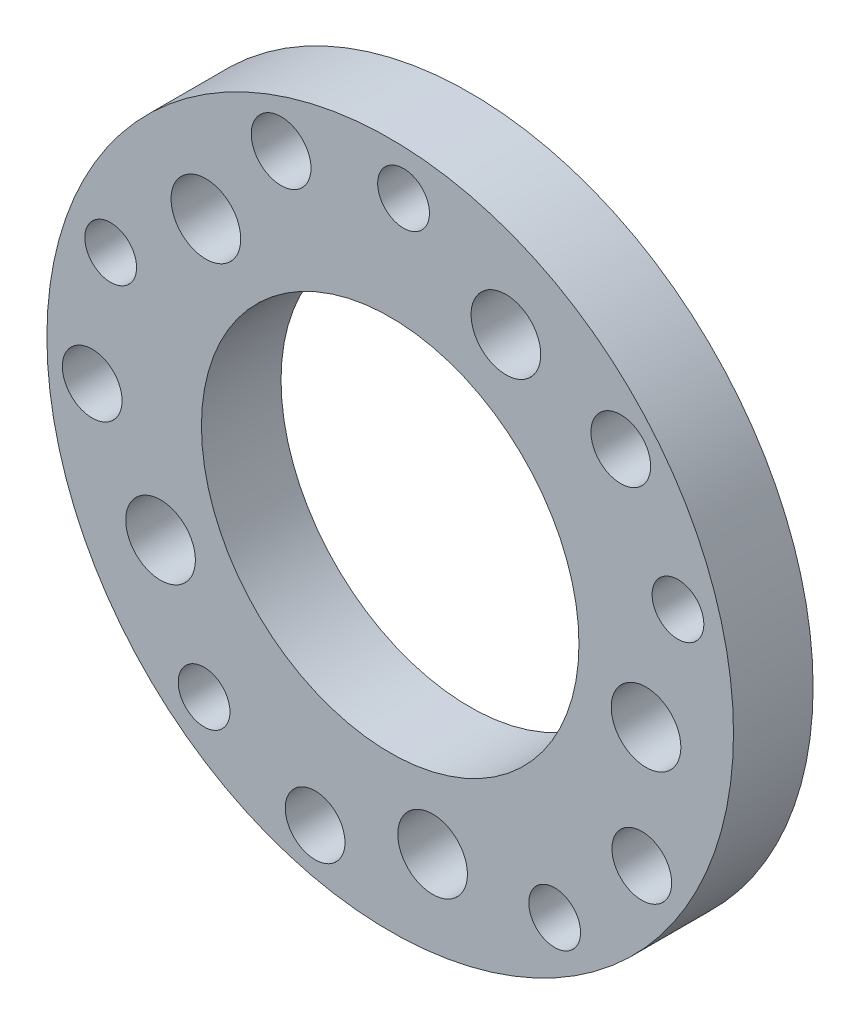
ISO-10303-21;
HEADER;
FILE_DESCRIPTION(('STEP AP214'),'2;1');
FILE_NAME('part.step','',(''),(''),'','','');
FILE_SCHEMA(('AUTOMOTIVE_DESIGN { 1 0 10303 214 1 1 1 1 }'));
ENDSEC;
DATA;
#1=APPLICATION_CONTEXT('core data for automotive mechanical design processes');
#2=APPLICATION_PROTOCOL_DEFINITION('international standard','automotive_design',2000,#1);
#3=PRODUCT_CONTEXT('',#1,'mechanical');
#4=PRODUCT('Part','Part','',(#3));
#5=PRODUCT_RELATED_PRODUCT_CATEGORY('part','',(#4));
#6=PRODUCT_DEFINITION_FORMATION('','',#4);
#7=PRODUCT_DEFINITION_CONTEXT('part definition',#1,'design');
#8=PRODUCT_DEFINITION('design','',#6,#7);
#9=PRODUCT_DEFINITION_SHAPE('','',#8);
#10=(LENGTH_UNIT() NAMED_UNIT(*) SI_UNIT(.MILLI.,.METRE.));
#11=(NAMED_UNIT(*) PLANE_ANGLE_UNIT() SI_UNIT($,.RADIAN.));
#12=(NAMED_UNIT(*) SI_UNIT($,.STERADIAN.) SOLID_ANGLE_UNIT());
#13=UNCERTAINTY_MEASURE_WITH_UNIT(LENGTH_MEASURE(1.E-05),#10,'distance_accuracy_value','');
#14=(GEOMETRIC_REPRESENTATION_CONTEXT(3) GLOBAL_UNCERTAINTY_ASSIGNED_CONTEXT((#13)) GLOBAL_UNIT_ASSIGNED_CONTEXT((#10,
#11,#12)) REPRESENTATION_CONTEXT('',''));
#15=CARTESIAN_POINT('',(0.,0.,0.));
#16=DIRECTION('',(0.,0.,1.));
#17=DIRECTION('',(1.,0.,0.));
#18=AXIS2_PLACEMENT_3D('',#15,#16,#17);
#19=CARTESIAN_POINT('',(0.,0.,4.));
#20=DIRECTION('',(0.,0.,1.));
#21=DIRECTION('',(1.,0.,0.));
#22=AXIS2_PLACEMENT_3D('',#19,#20,#21);
#23=PLANE('',#22);
#24=CARTESIAN_POINT('',(-11.5381983432804,-5.9891551149651,4.));
#25=DIRECTION('',(0.,0.,1.));
#26=DIRECTION('',(1.,0.,0.));
#27=AXIS2_PLACEMENT_3D('',#24,#25,#26);
#28=CIRCLE('',#27,1.75000000000102);
#29=CARTESIAN_POINT('',(-9.7881983432794,-5.9891551149651,4.));
#30=VERTEX_POINT('',#29);
#31=EDGE_CURVE('E160',#30,#30,#28,.T.);
#32=ORIENTED_EDGE('',*,*,#31,.F.);
#33=EDGE_LOOP('',(#32));
#34=FACE_BOUND('',#33,.T.);
#35=CARTESIAN_POINT('',(12.854935594452,-1.93665455425201,4.));
#36=DIRECTION('',(0.,0.,1.));
#37=DIRECTION('',(1.,0.,0.));
#38=AXIS2_PLACEMENT_3D('',#35,#36,#37);
#39=CIRCLE('',#38,1.74999999999994);
#40=CARTESIAN_POINT('',(14.6049355944519,-1.93665455425201,4.));
#41=VERTEX_POINT('',#40);
#42=EDGE_CURVE('E144',#41,#41,#39,.T.);
#43=ORIENTED_EDGE('',*,*,#42,.F.);
#44=EDGE_LOOP('',(#43));
#45=FACE_BOUND('',#44,.T.);
#46=CARTESIAN_POINT('',(-5.48108740948667,13.9627246914615,4.));
#47=DIRECTION('',(0.,0.,1.));
#48=DIRECTION('',(1.,0.,0.));
#49=AXIS2_PLACEMENT_3D('',#46,#47,#48);
#50=CIRCLE('',#49,1.5);
#51=CARTESIAN_POINT('',(-3.98108740948667,13.9627246914615,4.));
#52=VERTEX_POINT('',#51);
#53=EDGE_CURVE('E128',#52,#52,#50,.T.);
#54=ORIENTED_EDGE('',*,*,#53,.F.);
#55=EDGE_LOOP('',(#54));
#56=FACE_BOUND('',#55,.T.);
#57=CARTESIAN_POINT('',(14.4591650686077,3.9915592841338,4.));
#58=DIRECTION('',(0.,0.,1.));
#59=DIRECTION('',(1.,0.,0.));
#60=AXIS2_PLACEMENT_3D('',#57,#58,#59);
#61=CIRCLE('',#60,1.3);
#62=CARTESIAN_POINT('',(15.7591650686077,3.9915592841338,4.));
#63=VERTEX_POINT('',#62);
#64=EDGE_CURVE('E112',#63,#63,#61,.T.);
#65=ORIENTED_EDGE('',*,*,#64,.F.);
#66=EDGE_LOOP('',(#65));
#67=FACE_BOUND('',#66,.T.);
#68=CARTESIAN_POINT('',(0.671929263318479,14.9849428115391,4.));
#69=DIRECTION('',(0.,0.,1.));
#70=DIRECTION('',(1.,0.,0.));
#71=AXIS2_PLACEMENT_3D('',#68,#69,#70);
#72=CIRCLE('',#71,1.3);
#73=CARTESIAN_POINT('',(1.97192926331848,14.9849428115391,4.));
#74=VERTEX_POINT('',#73);
#75=EDGE_CURVE('E96',#74,#74,#72,.T.);
#76=ORIENTED_EDGE('',*,*,#75,.F.);
#77=EDGE_LOOP('',(#76));
#78=FACE_BOUND('',#77,.T.);
#79=CARTESIAN_POINT('',(-14.0438899458412,5.26964469287068,4.));
#80=DIRECTION('',(0.,0.,1.));
#81=DIRECTION('',(1.,0.,0.));
#82=AXIS2_PLACEMENT_3D('',#79,#80,#81);
#83=CIRCLE('',#82,1.3);
#84=CARTESIAN_POINT('',(-12.7438899458412,5.26964469287068,4.));
#85=VERTEX_POINT('',#84);
#86=EDGE_CURVE('E80',#85,#85,#83,.T.);
#87=ORIENTED_EDGE('',*,*,#86,.F.);
#88=EDGE_LOOP('',(#87));
#89=FACE_BOUND('',#88,.T.);
#90=CARTESIAN_POINT('',(11.5855911458645,9.52754311461596,4.));
#91=DIRECTION('',(0.,0.,1.));
#92=DIRECTION('',(1.,0.,0.));
#93=AXIS2_PLACEMENT_3D('',#90,#91,#92);
#94=CIRCLE('',#93,1.5);
#95=CARTESIAN_POINT('',(13.0855911458645,9.52754311461596,4.));
#96=VERTEX_POINT('',#95);
#97=EDGE_CURVE('E64',#96,#96,#94,.T.);
#98=ORIENTED_EDGE('',*,*,#97,.F.);
#99=EDGE_LOOP('',(#98));
#100=FACE_BOUND('',#99,.T.);
#101=CARTESIAN_POINT('',(0.,0.,4.));
#102=DIRECTION('',(0.,0.,1.));
#103=DIRECTION('',(1.,0.,0.));
#104=AXIS2_PLACEMENT_3D('',#101,#102,#103);
#105=CIRCLE('',#104,9.485);
#106=CARTESIAN_POINT('',(9.485,0.,4.));
#107=VERTEX_POINT('',#106);
#108=EDGE_CURVE('E50',#107,#107,#105,.T.);
#109=ORIENTED_EDGE('',*,*,#108,.F.);
#110=EDGE_LOOP('',(#109));
#111=FACE_BOUND('',#110,.T.);
#112=CARTESIAN_POINT('',(0.,0.,4.));
#113=DIRECTION('',(0.,0.,1.));
#114=DIRECTION('',(1.,0.,0.));
#115=AXIS2_PLACEMENT_3D('',#112,#113,#114);
#116=CIRCLE('',#115,17.25);
#117=CARTESIAN_POINT('',(17.25,0.,4.));
#118=VERTEX_POINT('',#117);
#119=EDGE_CURVE('E10',#118,#118,#116,.T.);
#120=ORIENTED_EDGE('',*,*,#119,.T.);
#121=EDGE_LOOP('',(#120));
#122=FACE_BOUND('',#121,.T.);
#123=CARTESIAN_POINT('',(8.26432619802639,-12.5180235058341,4.));
#124=DIRECTION('',(0.,0.,1.));
#125=DIRECTION('',(1.,0.,0.));
#126=AXIS2_PLACEMENT_3D('',#123,#124,#125);
#127=CIRCLE('',#126,1.3);
#128=CARTESIAN_POINT('',(9.56432619802639,-12.5180235058341,4.));
#129=VERTEX_POINT('',#128);
#130=EDGE_CURVE('E56',#129,#129,#127,.T.);
#131=ORIENTED_EDGE('',*,*,#130,.F.);
#132=EDGE_LOOP('',(#131));
#133=FACE_BOUND('',#132,.T.);
#134=CARTESIAN_POINT('',(-9.35153058411119,-11.7281232827095,4.));
#135=DIRECTION('',(0.,0.,1.));
#136=DIRECTION('',(1.,0.,0.));
#137=AXIS2_PLACEMENT_3D('',#134,#135,#136);
#138=CIRCLE('',#137,1.3);
#139=CARTESIAN_POINT('',(-8.05153058411119,-11.7281232827095,4.));
#140=VERTEX_POINT('',#139);
#141=EDGE_CURVE('E72',#140,#140,#138,.T.);
#142=ORIENTED_EDGE('',*,*,#141,.F.);
#143=EDGE_LOOP('',(#142));
#144=FACE_BOUND('',#143,.T.);
#145=CARTESIAN_POINT('',(12.6413765173913,-8.07437921734947,4.));
#146=DIRECTION('',(0.,0.,1.));
#147=DIRECTION('',(1.,0.,0.));
#148=AXIS2_PLACEMENT_3D('',#145,#146,#147);
#149=CIRCLE('',#148,1.5);
#150=CARTESIAN_POINT('',(14.1413765173913,-8.07437921734947,4.));
#151=VERTEX_POINT('',#150);
#152=EDGE_CURVE('E88',#151,#151,#149,.T.);
#153=ORIENTED_EDGE('',*,*,#152,.F.);
#154=EDGE_LOOP('',(#153));
#155=FACE_BOUND('',#154,.T.);
#156=CARTESIAN_POINT('',(-3.77279079353133,-14.5177839089944,4.));
#157=DIRECTION('',(0.,0.,1.));
#158=DIRECTION('',(1.,0.,0.));
#159=AXIS2_PLACEMENT_3D('',#156,#157,#158);
#160=CIRCLE('',#159,1.5);
#161=CARTESIAN_POINT('',(-2.27279079353133,-14.5177839089944,4.));
#162=VERTEX_POINT('',#161);
#163=EDGE_CURVE('E104',#162,#162,#160,.T.);
#164=ORIENTED_EDGE('',*,*,#163,.F.);
#165=EDGE_LOOP('',(#164));
#166=FACE_BOUND('',#165,.T.);
#167=CARTESIAN_POINT('',(-14.9730894602358,-0.898104679736045,4.));
#168=DIRECTION('',(0.,0.,1.));
#169=DIRECTION('',(1.,0.,0.));
#170=AXIS2_PLACEMENT_3D('',#167,#168,#169);
#171=CIRCLE('',#170,1.5);
#172=CARTESIAN_POINT('',(-13.4730894602358,-0.898104679736045,4.));
#173=VERTEX_POINT('',#172);
#174=EDGE_CURVE('E120',#173,#173,#171,.T.);
#175=ORIENTED_EDGE('',*,*,#174,.F.);
#176=EDGE_LOOP('',(#175));
#177=FACE_BOUND('',#176,.T.);
#178=CARTESIAN_POINT('',(5.81426149391524,11.6273110941599,4.));
#179=DIRECTION('',(0.,0.,1.));
#180=DIRECTION('',(1.,0.,0.));
#181=AXIS2_PLACEMENT_3D('',#178,#179,#180);
#182=CIRCLE('',#181,1.75);
#183=CARTESIAN_POINT('',(7.56426149391524,11.6273110941599,4.));
#184=VERTEX_POINT('',#183);
#185=EDGE_CURVE('E136',#184,#184,#182,.T.);
#186=ORIENTED_EDGE('',*,*,#185,.F.);
#187=EDGE_LOOP('',(#186));
#188=FACE_BOUND('',#187,.T.);
#189=CARTESIAN_POINT('',(2.1305256266476,-12.8242294331553,4.));
#190=DIRECTION('',(0.,0.,1.));
#191=DIRECTION('',(1.,0.,0.));
#192=AXIS2_PLACEMENT_3D('',#189,#190,#191);
#193=CIRCLE('',#192,1.75000000000055);
#194=CARTESIAN_POINT('',(3.88052562664815,-12.8242294331553,4.));
#195=VERTEX_POINT('',#194);
#196=EDGE_CURVE('E152',#195,#195,#193,.T.);
#197=ORIENTED_EDGE('',*,*,#196,.F.);
#198=EDGE_LOOP('',(#197));
#199=FACE_BOUND('',#198,.T.);
#200=CARTESIAN_POINT('',(-9.26152437173195,9.12272800821123,4.));
#201=DIRECTION('',(0.,0.,1.));
#202=DIRECTION('',(1.,0.,0.));
#203=AXIS2_PLACEMENT_3D('',#200,#201,#202);
#204=CIRCLE('',#203,1.75000000000074);
#205=CARTESIAN_POINT('',(-7.51152437173121,9.12272800821123,4.));
#206=VERTEX_POINT('',#205);
#207=EDGE_CURVE('E168',#206,#206,#204,.T.);
#208=ORIENTED_EDGE('',*,*,#207,.F.);
#209=EDGE_LOOP('',(#208));
#210=FACE_BOUND('',#209,.T.);
#211=ADVANCED_FACE('F37',(#34,#45,#56,#67,#78,#89,#100,#111,#122,#133,#144,#155,#166,#177,#188,
#199,#210),#23,.T.);
#212=CARTESIAN_POINT('',(0.,0.,0.));
#213=DIRECTION('',(0.,0.,1.));
#214=DIRECTION('',(1.,0.,0.));
#215=AXIS2_PLACEMENT_3D('',#212,#213,#214);
#216=PLANE('',#215);
#217=CARTESIAN_POINT('',(0.,0.,0.));
#218=DIRECTION('',(0.,0.,1.));
#219=DIRECTION('',(1.,0.,0.));
#220=AXIS2_PLACEMENT_3D('',#217,#218,#219);
#221=CIRCLE('',#220,17.25);
#222=CARTESIAN_POINT('',(17.25,0.,0.));
#223=VERTEX_POINT('',#222);
#224=EDGE_CURVE('E41',#223,#223,#221,.T.);
#225=ORIENTED_EDGE('',*,*,#224,.F.);
#226=EDGE_LOOP('',(#225));
#227=FACE_BOUND('',#226,.T.);
#228=CARTESIAN_POINT('',(0.,0.,0.));
#229=DIRECTION('',(0.,0.,1.));
#230=DIRECTION('',(1.,0.,0.));
#231=AXIS2_PLACEMENT_3D('',#228,#229,#230);
#232=CIRCLE('',#231,9.485);
#233=CARTESIAN_POINT('',(9.485,0.,0.));
#234=VERTEX_POINT('',#233);
#235=EDGE_CURVE('E52',#234,#234,#232,.T.);
#236=ORIENTED_EDGE('',*,*,#235,.T.);
#237=EDGE_LOOP('',(#236));
#238=FACE_BOUND('',#237,.T.);
#239=CARTESIAN_POINT('',(8.26432619802639,-12.5180235058341,0.));
#240=DIRECTION('',(0.,0.,1.));
#241=DIRECTION('',(1.,0.,0.));
#242=AXIS2_PLACEMENT_3D('',#239,#240,#241);
#243=CIRCLE('',#242,1.3);
#244=CARTESIAN_POINT('',(9.56432619802639,-12.5180235058341,0.));
#245=VERTEX_POINT('',#244);
#246=EDGE_CURVE('E60',#245,#245,#243,.T.);
#247=ORIENTED_EDGE('',*,*,#246,.T.);
#248=EDGE_LOOP('',(#247));
#249=FACE_BOUND('',#248,.T.);
#250=CARTESIAN_POINT('',(11.5855911458645,9.52754311461596,0.));
#251=DIRECTION('',(0.,0.,1.));
#252=DIRECTION('',(1.,0.,0.));
#253=AXIS2_PLACEMENT_3D('',#250,#251,#252);
#254=CIRCLE('',#253,1.5);
#255=CARTESIAN_POINT('',(13.0855911458645,9.52754311461596,0.));
#256=VERTEX_POINT('',#255);
#257=EDGE_CURVE('E68',#256,#256,#254,.T.);
#258=ORIENTED_EDGE('',*,*,#257,.T.);
#259=EDGE_LOOP('',(#258));
#260=FACE_BOUND('',#259,.T.);
#261=CARTESIAN_POINT('',(-9.35153058411119,-11.7281232827095,0.));
#262=DIRECTION('',(0.,0.,1.));
#263=DIRECTION('',(1.,0.,0.));
#264=AXIS2_PLACEMENT_3D('',#261,#262,#263);
#265=CIRCLE('',#264,1.3);
#266=CARTESIAN_POINT('',(-8.05153058411119,-11.7281232827095,0.));
#267=VERTEX_POINT('',#266);
#268=EDGE_CURVE('E76',#267,#267,#265,.T.);
#269=ORIENTED_EDGE('',*,*,#268,.T.);
#270=EDGE_LOOP('',(#269));
#271=FACE_BOUND('',#270,.T.);
#272=CARTESIAN_POINT('',(-14.0438899458412,5.26964469287068,0.));
#273=DIRECTION('',(0.,0.,1.));
#274=DIRECTION('',(1.,0.,0.));
#275=AXIS2_PLACEMENT_3D('',#272,#273,#274);
#276=CIRCLE('',#275,1.3);
#277=CARTESIAN_POINT('',(-12.7438899458412,5.26964469287068,0.));
#278=VERTEX_POINT('',#277);
#279=EDGE_CURVE('E84',#278,#278,#276,.T.);
#280=ORIENTED_EDGE('',*,*,#279,.T.);
#281=EDGE_LOOP('',(#280));
#282=FACE_BOUND('',#281,.T.);
#283=CARTESIAN_POINT('',(12.6413765173913,-8.07437921734947,0.));
#284=DIRECTION('',(0.,0.,1.));
#285=DIRECTION('',(1.,0.,0.));
#286=AXIS2_PLACEMENT_3D('',#283,#284,#285);
#287=CIRCLE('',#286,1.5);
#288=CARTESIAN_POINT('',(14.1413765173913,-8.07437921734947,0.));
#289=VERTEX_POINT('',#288);
#290=EDGE_CURVE('E92',#289,#289,#287,.T.);
#291=ORIENTED_EDGE('',*,*,#290,.T.);
#292=EDGE_LOOP('',(#291));
#293=FACE_BOUND('',#292,.T.);
#294=CARTESIAN_POINT('',(0.671929263318479,14.9849428115391,0.));
#295=DIRECTION('',(0.,0.,1.));
#296=DIRECTION('',(1.,0.,0.));
#297=AXIS2_PLACEMENT_3D('',#294,#295,#296);
#298=CIRCLE('',#297,1.3);
#299=CARTESIAN_POINT('',(1.97192926331848,14.9849428115391,0.));
#300=VERTEX_POINT('',#299);
#301=EDGE_CURVE('E100',#300,#300,#298,.T.);
#302=ORIENTED_EDGE('',*,*,#301,.T.);
#303=EDGE_LOOP('',(#302));
#304=FACE_BOUND('',#303,.T.);
#305=CARTESIAN_POINT('',(-3.77279079353133,-14.5177839089944,0.));
#306=DIRECTION('',(0.,0.,1.));
#307=DIRECTION('',(1.,0.,0.));
#308=AXIS2_PLACEMENT_3D('',#305,#306,#307);
#309=CIRCLE('',#308,1.5);
#310=CARTESIAN_POINT('',(-2.27279079353133,-14.5177839089944,0.));
#311=VERTEX_POINT('',#310);
#312=EDGE_CURVE('E108',#311,#311,#309,.T.);
#313=ORIENTED_EDGE('',*,*,#312,.T.);
#314=EDGE_LOOP('',(#313));
#315=FACE_BOUND('',#314,.T.);
#316=CARTESIAN_POINT('',(14.4591650686077,3.9915592841338,0.));
#317=DIRECTION('',(0.,0.,1.));
#318=DIRECTION('',(1.,0.,0.));
#319=AXIS2_PLACEMENT_3D('',#316,#317,#318);
#320=CIRCLE('',#319,1.3);
#321=CARTESIAN_POINT('',(15.7591650686077,3.9915592841338,0.));
#322=VERTEX_POINT('',#321);
#323=EDGE_CURVE('E116',#322,#322,#320,.T.);
#324=ORIENTED_EDGE('',*,*,#323,.T.);
#325=EDGE_LOOP('',(#324));
#326=FACE_BOUND('',#325,.T.);
#327=CARTESIAN_POINT('',(-14.9730894602358,-0.898104679736045,0.));
#328=DIRECTION('',(0.,0.,1.));
#329=DIRECTION('',(1.,0.,0.));
#330=AXIS2_PLACEMENT_3D('',#327,#328,#329);
#331=CIRCLE('',#330,1.5);
#332=CARTESIAN_POINT('',(-13.4730894602358,-0.898104679736045,0.));
#333=VERTEX_POINT('',#332);
#334=EDGE_CURVE('E124',#333,#333,#331,.T.);
#335=ORIENTED_EDGE('',*,*,#334,.T.);
#336=EDGE_LOOP('',(#335));
#337=FACE_BOUND('',#336,.T.);
#338=CARTESIAN_POINT('',(-5.48108740948667,13.9627246914615,0.));
#339=DIRECTION('',(0.,0.,1.));
#340=DIRECTION('',(1.,0.,0.));
#341=AXIS2_PLACEMENT_3D('',#338,#339,#340);
#342=CIRCLE('',#341,1.5);
#343=CARTESIAN_POINT('',(-3.98108740948667,13.9627246914615,0.));
#344=VERTEX_POINT('',#343);
#345=EDGE_CURVE('E132',#344,#344,#342,.T.);
#346=ORIENTED_EDGE('',*,*,#345,.T.);
#347=EDGE_LOOP('',(#346));
#348=FACE_BOUND('',#347,.T.);
#349=CARTESIAN_POINT('',(5.81426149391524,11.6273110941599,0.));
#350=DIRECTION('',(0.,0.,1.));
#351=DIRECTION('',(1.,0.,0.));
#352=AXIS2_PLACEMENT_3D('',#349,#350,#351);
#353=CIRCLE('',#352,1.75);
#354=CARTESIAN_POINT('',(7.56426149391524,11.6273110941599,0.));
#355=VERTEX_POINT('',#354);
#356=EDGE_CURVE('E140',#355,#355,#353,.T.);
#357=ORIENTED_EDGE('',*,*,#356,.T.);
#358=EDGE_LOOP('',(#357));
#359=FACE_BOUND('',#358,.T.);
#360=CARTESIAN_POINT('',(12.854935594452,-1.93665455425201,0.));
#361=DIRECTION('',(0.,0.,1.));
#362=DIRECTION('',(1.,0.,0.));
#363=AXIS2_PLACEMENT_3D('',#360,#361,#362);
#364=CIRCLE('',#363,1.74999999999994);
#365=CARTESIAN_POINT('',(14.6049355944519,-1.93665455425201,0.));
#366=VERTEX_POINT('',#365);
#367=EDGE_CURVE('E148',#366,#366,#364,.T.);
#368=ORIENTED_EDGE('',*,*,#367,.T.);
#369=EDGE_LOOP('',(#368));
#370=FACE_BOUND('',#369,.T.);
#371=CARTESIAN_POINT('',(2.1305256266476,-12.8242294331553,0.));
#372=DIRECTION('',(0.,0.,1.));
#373=DIRECTION('',(1.,0.,0.));
#374=AXIS2_PLACEMENT_3D('',#371,#372,#373);
#375=CIRCLE('',#374,1.75000000000055);
#376=CARTESIAN_POINT('',(3.88052562664815,-12.8242294331553,0.));
#377=VERTEX_POINT('',#376);
#378=EDGE_CURVE('E156',#377,#377,#375,.T.);
#379=ORIENTED_EDGE('',*,*,#378,.T.);
#380=EDGE_LOOP('',(#379));
#381=FACE_BOUND('',#380,.T.);
#382=CARTESIAN_POINT('',(-11.5381983432804,-5.9891551149651,0.));
#383=DIRECTION('',(0.,0.,1.));
#384=DIRECTION('',(1.,0.,0.));
#385=AXIS2_PLACEMENT_3D('',#382,#383,#384);
#386=CIRCLE('',#385,1.75000000000102);
#387=CARTESIAN_POINT('',(-9.7881983432794,-5.9891551149651,0.));
#388=VERTEX_POINT('',#387);
#389=EDGE_CURVE('E164',#388,#388,#386,.T.);
#390=ORIENTED_EDGE('',*,*,#389,.T.);
#391=EDGE_LOOP('',(#390));
#392=FACE_BOUND('',#391,.T.);
#393=CARTESIAN_POINT('',(-9.26152437173195,9.12272800821123,0.));
#394=DIRECTION('',(0.,0.,1.));
#395=DIRECTION('',(1.,0.,0.));
#396=AXIS2_PLACEMENT_3D('',#393,#394,#395);
#397=CIRCLE('',#396,1.75000000000074);
#398=CARTESIAN_POINT('',(-7.51152437173121,9.12272800821123,0.));
#399=VERTEX_POINT('',#398);
#400=EDGE_CURVE('E172',#399,#399,#397,.T.);
#401=ORIENTED_EDGE('',*,*,#400,.T.);
#402=EDGE_LOOP('',(#401));
#403=FACE_BOUND('',#402,.T.);
#404=ADVANCED_FACE('F184',(#227,#238,#249,#260,#271,#282,#293,#304,#315,#326,#337,#348,#359,
#370,#381,#392,#403),#216,.F.);
#405=CARTESIAN_POINT('',(0.,0.,4.));
#406=DIRECTION('',(0.,0.,-1.));
#407=DIRECTION('',(-1.,0.,0.));
#408=AXIS2_PLACEMENT_3D('',#405,#406,#407);
#409=CYLINDRICAL_SURFACE('',#408,17.25);
#410=ORIENTED_EDGE('',*,*,#119,.F.);
#411=EDGE_LOOP('',(#410));
#412=FACE_BOUND('',#411,.T.);
#413=ORIENTED_EDGE('',*,*,#224,.T.);
#414=EDGE_LOOP('',(#413));
#415=FACE_BOUND('',#414,.T.);
#416=ADVANCED_FACE('F39',(#412,#415),#409,.T.);
#417=CARTESIAN_POINT('',(0.,0.,4.));
#418=DIRECTION('',(0.,0.,-1.));
#419=DIRECTION('',(-1.,0.,0.));
#420=AXIS2_PLACEMENT_3D('',#417,#418,#419);
#421=CYLINDRICAL_SURFACE('',#420,9.485);
#422=ORIENTED_EDGE('',*,*,#108,.T.);
#423=EDGE_LOOP('',(#422));
#424=FACE_BOUND('',#423,.T.);
#425=ORIENTED_EDGE('',*,*,#235,.F.);
#426=EDGE_LOOP('',(#425));
#427=FACE_BOUND('',#426,.T.);
#428=ADVANCED_FACE('F194',(#424,#427),#421,.F.);
#429=CARTESIAN_POINT('',(8.26432619802639,-12.5180235058341,4.));
#430=DIRECTION('',(0.,0.,-1.));
#431=DIRECTION('',(-1.,0.,0.));
#432=AXIS2_PLACEMENT_3D('',#429,#430,#431);
#433=CYLINDRICAL_SURFACE('',#432,1.3);
#434=ORIENTED_EDGE('',*,*,#130,.T.);
#435=EDGE_LOOP('',(#434));
#436=FACE_BOUND('',#435,.T.);
#437=ORIENTED_EDGE('',*,*,#246,.F.);
#438=EDGE_LOOP('',(#437));
#439=FACE_BOUND('',#438,.T.);
#440=ADVANCED_FACE('F197',(#436,#439),#433,.F.);
#441=CARTESIAN_POINT('',(11.5855911458645,9.52754311461596,4.));
#442=DIRECTION('',(0.,0.,-1.));
#443=DIRECTION('',(-1.,0.,0.));
#444=AXIS2_PLACEMENT_3D('',#441,#442,#443);
#445=CYLINDRICAL_SURFACE('',#444,1.5);
#446=ORIENTED_EDGE('',*,*,#97,.T.);
#447=EDGE_LOOP('',(#446));
#448=FACE_BOUND('',#447,.T.);
#449=ORIENTED_EDGE('',*,*,#257,.F.);
#450=EDGE_LOOP('',(#449));
#451=FACE_BOUND('',#450,.T.);
#452=ADVANCED_FACE('F201',(#448,#451),#445,.F.);
#453=CARTESIAN_POINT('',(-9.35153058411119,-11.7281232827095,4.));
#454=DIRECTION('',(0.,0.,-1.));
#455=DIRECTION('',(-1.,0.,0.));
#456=AXIS2_PLACEMENT_3D('',#453,#454,#455);
#457=CYLINDRICAL_SURFACE('',#456,1.3);
#458=ORIENTED_EDGE('',*,*,#141,.T.);
#459=EDGE_LOOP('',(#458));
#460=FACE_BOUND('',#459,.T.);
#461=ORIENTED_EDGE('',*,*,#268,.F.);
#462=EDGE_LOOP('',(#461));
#463=FACE_BOUND('',#462,.T.);
#464=ADVANCED_FACE('F205',(#460,#463),#457,.F.);
#465=CARTESIAN_POINT('',(-14.0438899458412,5.26964469287068,4.));
#466=DIRECTION('',(0.,0.,-1.));
#467=DIRECTION('',(-1.,0.,0.));
#468=AXIS2_PLACEMENT_3D('',#465,#466,#467);
#469=CYLINDRICAL_SURFACE('',#468,1.3);
#470=ORIENTED_EDGE('',*,*,#86,.T.);
#471=EDGE_LOOP('',(#470));
#472=FACE_BOUND('',#471,.T.);
#473=ORIENTED_EDGE('',*,*,#279,.F.);
#474=EDGE_LOOP('',(#473));
#475=FACE_BOUND('',#474,.T.);
#476=ADVANCED_FACE('F209',(#472,#475),#469,.F.);
#477=CARTESIAN_POINT('',(12.6413765173913,-8.07437921734947,4.));
#478=DIRECTION('',(0.,0.,-1.));
#479=DIRECTION('',(-1.,0.,0.));
#480=AXIS2_PLACEMENT_3D('',#477,#478,#479);
#481=CYLINDRICAL_SURFACE('',#480,1.5);
#482=ORIENTED_EDGE('',*,*,#152,.T.);
#483=EDGE_LOOP('',(#482));
#484=FACE_BOUND('',#483,.T.);
#485=ORIENTED_EDGE('',*,*,#290,.F.);
#486=EDGE_LOOP('',(#485));
#487=FACE_BOUND('',#486,.T.);
#488=ADVANCED_FACE('F213',(#484,#487),#481,.F.);
#489=CARTESIAN_POINT('',(0.671929263318479,14.9849428115391,4.));
#490=DIRECTION('',(0.,0.,-1.));
#491=DIRECTION('',(-1.,0.,0.));
#492=AXIS2_PLACEMENT_3D('',#489,#490,#491);
#493=CYLINDRICAL_SURFACE('',#492,1.3);
#494=ORIENTED_EDGE('',*,*,#75,.T.);
#495=EDGE_LOOP('',(#494));
#496=FACE_BOUND('',#495,.T.);
#497=ORIENTED_EDGE('',*,*,#301,.F.);
#498=EDGE_LOOP('',(#497));
#499=FACE_BOUND('',#498,.T.);
#500=ADVANCED_FACE('F217',(#496,#499),#493,.F.);
#501=CARTESIAN_POINT('',(-3.77279079353133,-14.5177839089944,4.));
#502=DIRECTION('',(0.,0.,-1.));
#503=DIRECTION('',(-1.,0.,0.));
#504=AXIS2_PLACEMENT_3D('',#501,#502,#503);
#505=CYLINDRICAL_SURFACE('',#504,1.5);
#506=ORIENTED_EDGE('',*,*,#163,.T.);
#507=EDGE_LOOP('',(#506));
#508=FACE_BOUND('',#507,.T.);
#509=ORIENTED_EDGE('',*,*,#312,.F.);
#510=EDGE_LOOP('',(#509));
#511=FACE_BOUND('',#510,.T.);
#512=ADVANCED_FACE('F221',(#508,#511),#505,.F.);
#513=CARTESIAN_POINT('',(14.4591650686077,3.9915592841338,4.));
#514=DIRECTION('',(0.,0.,-1.));
#515=DIRECTION('',(-1.,0.,0.));
#516=AXIS2_PLACEMENT_3D('',#513,#514,#515);
#517=CYLINDRICAL_SURFACE('',#516,1.3);
#518=ORIENTED_EDGE('',*,*,#64,.T.);
#519=EDGE_LOOP('',(#518));
#520=FACE_BOUND('',#519,.T.);
#521=ORIENTED_EDGE('',*,*,#323,.F.);
#522=EDGE_LOOP('',(#521));
#523=FACE_BOUND('',#522,.T.);
#524=ADVANCED_FACE('F225',(#520,#523),#517,.F.);
#525=CARTESIAN_POINT('',(-14.9730894602358,-0.898104679736045,4.));
#526=DIRECTION('',(0.,0.,-1.));
#527=DIRECTION('',(-1.,0.,0.));
#528=AXIS2_PLACEMENT_3D('',#525,#526,#527);
#529=CYLINDRICAL_SURFACE('',#528,1.5);
#530=ORIENTED_EDGE('',*,*,#174,.T.);
#531=EDGE_LOOP('',(#530));
#532=FACE_BOUND('',#531,.T.);
#533=ORIENTED_EDGE('',*,*,#334,.F.);
#534=EDGE_LOOP('',(#533));
#535=FACE_BOUND('',#534,.T.);
#536=ADVANCED_FACE('F229',(#532,#535),#529,.F.);
#537=CARTESIAN_POINT('',(-5.48108740948667,13.9627246914615,4.));
#538=DIRECTION('',(0.,0.,-1.));
#539=DIRECTION('',(-1.,0.,0.));
#540=AXIS2_PLACEMENT_3D('',#537,#538,#539);
#541=CYLINDRICAL_SURFACE('',#540,1.5);
#542=ORIENTED_EDGE('',*,*,#53,.T.);
#543=EDGE_LOOP('',(#542));
#544=FACE_BOUND('',#543,.T.);
#545=ORIENTED_EDGE('',*,*,#345,.F.);
#546=EDGE_LOOP('',(#545));
#547=FACE_BOUND('',#546,.T.);
#548=ADVANCED_FACE('F233',(#544,#547),#541,.F.);
#549=CARTESIAN_POINT('',(5.81426149391524,11.6273110941599,4.));
#550=DIRECTION('',(0.,0.,-1.));
#551=DIRECTION('',(-1.,0.,0.));
#552=AXIS2_PLACEMENT_3D('',#549,#550,#551);
#553=CYLINDRICAL_SURFACE('',#552,1.75);
#554=ORIENTED_EDGE('',*,*,#185,.T.);
#555=EDGE_LOOP('',(#554));
#556=FACE_BOUND('',#555,.T.);
#557=ORIENTED_EDGE('',*,*,#356,.F.);
#558=EDGE_LOOP('',(#557));
#559=FACE_BOUND('',#558,.T.);
#560=ADVANCED_FACE('F237',(#556,#559),#553,.F.);
#561=CARTESIAN_POINT('',(12.854935594452,-1.93665455425201,4.));
#562=DIRECTION('',(0.,0.,-1.));
#563=DIRECTION('',(-1.,0.,0.));
#564=AXIS2_PLACEMENT_3D('',#561,#562,#563);
#565=CYLINDRICAL_SURFACE('',#564,1.74999999999994);
#566=ORIENTED_EDGE('',*,*,#42,.T.);
#567=EDGE_LOOP('',(#566));
#568=FACE_BOUND('',#567,.T.);
#569=ORIENTED_EDGE('',*,*,#367,.F.);
#570=EDGE_LOOP('',(#569));
#571=FACE_BOUND('',#570,.T.);
#572=ADVANCED_FACE('F241',(#568,#571),#565,.F.);
#573=CARTESIAN_POINT('',(2.1305256266476,-12.8242294331553,4.));
#574=DIRECTION('',(0.,0.,-1.));
#575=DIRECTION('',(-1.,0.,0.));
#576=AXIS2_PLACEMENT_3D('',#573,#574,#575);
#577=CYLINDRICAL_SURFACE('',#576,1.75000000000055);
#578=ORIENTED_EDGE('',*,*,#196,.T.);
#579=EDGE_LOOP('',(#578));
#580=FACE_BOUND('',#579,.T.);
#581=ORIENTED_EDGE('',*,*,#378,.F.);
#582=EDGE_LOOP('',(#581));
#583=FACE_BOUND('',#582,.T.);
#584=ADVANCED_FACE('F245',(#580,#583),#577,.F.);
#585=CARTESIAN_POINT('',(-11.5381983432804,-5.9891551149651,4.));
#586=DIRECTION('',(0.,0.,-1.));
#587=DIRECTION('',(-1.,0.,0.));
#588=AXIS2_PLACEMENT_3D('',#585,#586,#587);
#589=CYLINDRICAL_SURFACE('',#588,1.75000000000102);
#590=ORIENTED_EDGE('',*,*,#31,.T.);
#591=EDGE_LOOP('',(#590));
#592=FACE_BOUND('',#591,.T.);
#593=ORIENTED_EDGE('',*,*,#389,.F.);
#594=EDGE_LOOP('',(#593));
#595=FACE_BOUND('',#594,.T.);
#596=ADVANCED_FACE('F249',(#592,#595),#589,.F.);
#597=CARTESIAN_POINT('',(-9.26152437173195,9.12272800821123,4.));
#598=DIRECTION('',(0.,0.,-1.));
#599=DIRECTION('',(-1.,0.,0.));
#600=AXIS2_PLACEMENT_3D('',#597,#598,#599);
#601=CYLINDRICAL_SURFACE('',#600,1.75000000000074);
#602=ORIENTED_EDGE('',*,*,#207,.T.);
#603=EDGE_LOOP('',(#602));
#604=FACE_BOUND('',#603,.T.);
#605=ORIENTED_EDGE('',*,*,#400,.F.);
#606=EDGE_LOOP('',(#605));
#607=FACE_BOUND('',#606,.T.);
#608=ADVANCED_FACE('F180',(#604,#607),#601,.F.);
#609=CLOSED_SHELL('',(#211,#404,#416,#428,#440,#452,#464,#476,#488,#500,#512,#524,#536,#548,
#560,#572,#584,#596,#608));
#610=MANIFOLD_SOLID_BREP('B2',#609);
#611=ADVANCED_BREP_SHAPE_REPRESENTATION('',(#18,#610),#14);
#612=SHAPE_DEFINITION_REPRESENTATION(#9,#611);
ENDSEC;
END-ISO-10303-21;
